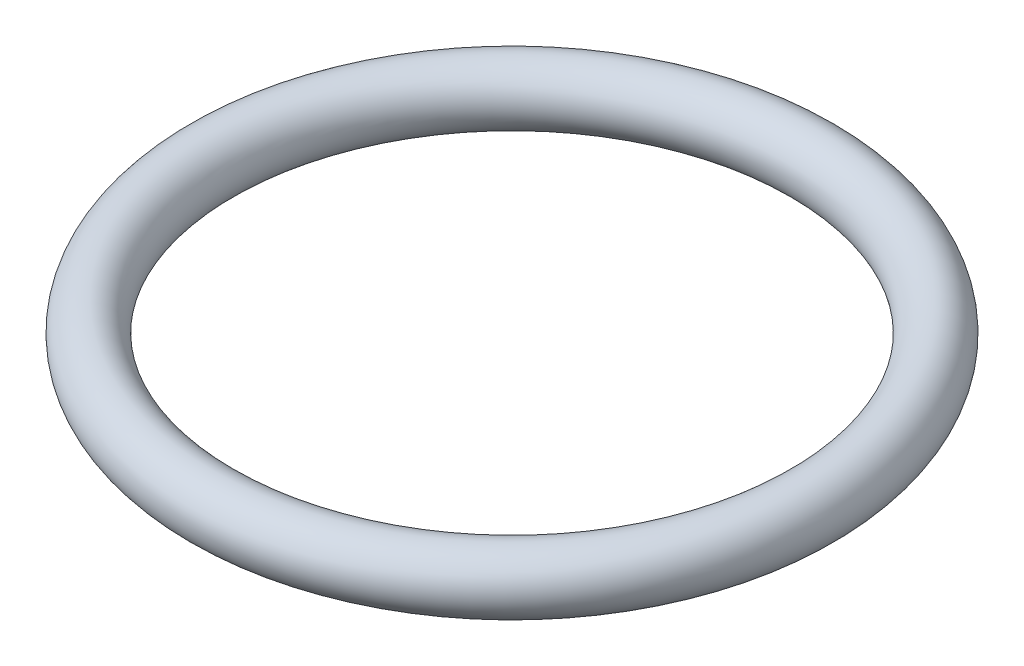
ISO-10303-21;
HEADER;
FILE_DESCRIPTION(('STEP AP214'),'2;1');
FILE_NAME('part.step','',(''),(''),'','','');
FILE_SCHEMA(('AUTOMOTIVE_DESIGN { 1 0 10303 214 1 1 1 1 }'));
ENDSEC;
DATA;
#1=APPLICATION_CONTEXT('core data for automotive mechanical design processes');
#2=APPLICATION_PROTOCOL_DEFINITION('international standard','automotive_design',2000,#1);
#3=PRODUCT_CONTEXT('',#1,'mechanical');
#4=PRODUCT('Part','Part','',(#3));
#5=PRODUCT_RELATED_PRODUCT_CATEGORY('part','',(#4));
#6=PRODUCT_DEFINITION_FORMATION('','',#4);
#7=PRODUCT_DEFINITION_CONTEXT('part definition',#1,'design');
#8=PRODUCT_DEFINITION('design','',#6,#7);
#9=PRODUCT_DEFINITION_SHAPE('','',#8);
#10=(LENGTH_UNIT() NAMED_UNIT(*) SI_UNIT(.MILLI.,.METRE.));
#11=(NAMED_UNIT(*) PLANE_ANGLE_UNIT() SI_UNIT($,.RADIAN.));
#12=(NAMED_UNIT(*) SI_UNIT($,.STERADIAN.) SOLID_ANGLE_UNIT());
#13=UNCERTAINTY_MEASURE_WITH_UNIT(LENGTH_MEASURE(1.E-05),#10,'distance_accuracy_value','');
#14=(GEOMETRIC_REPRESENTATION_CONTEXT(3) GLOBAL_UNCERTAINTY_ASSIGNED_CONTEXT((#13)) GLOBAL_UNIT_ASSIGNED_CONTEXT((#10,
#11,#12)) REPRESENTATION_CONTEXT('',''));
#15=CARTESIAN_POINT('',(0.,0.,0.));
#16=DIRECTION('',(0.,0.,1.));
#17=DIRECTION('',(1.,0.,0.));
#18=AXIS2_PLACEMENT_3D('',#15,#16,#17);
#19=CARTESIAN_POINT('',(0.,0.,0.));
#20=DIRECTION('',(0.,1.,0.));
#21=DIRECTION('',(0.,0.,1.));
#22=AXIS2_PLACEMENT_3D('',#19,#20,#21);
#23=TOROIDAL_SURFACE('',#22,10.,1.);
#24=CARTESIAN_POINT('',(0.,0.,11.));
#25=VERTEX_POINT('',#24);
#26=VERTEX_LOOP('',#25);
#27=FACE_BOUND('',#26,.T.);
#28=ADVANCED_FACE('F28',(#27),#23,.T.);
#29=CLOSED_SHELL('',(#28));
#30=MANIFOLD_SOLID_BREP('B2',#29);
#31=ADVANCED_BREP_SHAPE_REPRESENTATION('',(#18,#30),#14);
#32=SHAPE_DEFINITION_REPRESENTATION(#9,#31);
ENDSEC;
END-ISO-10303-21;
